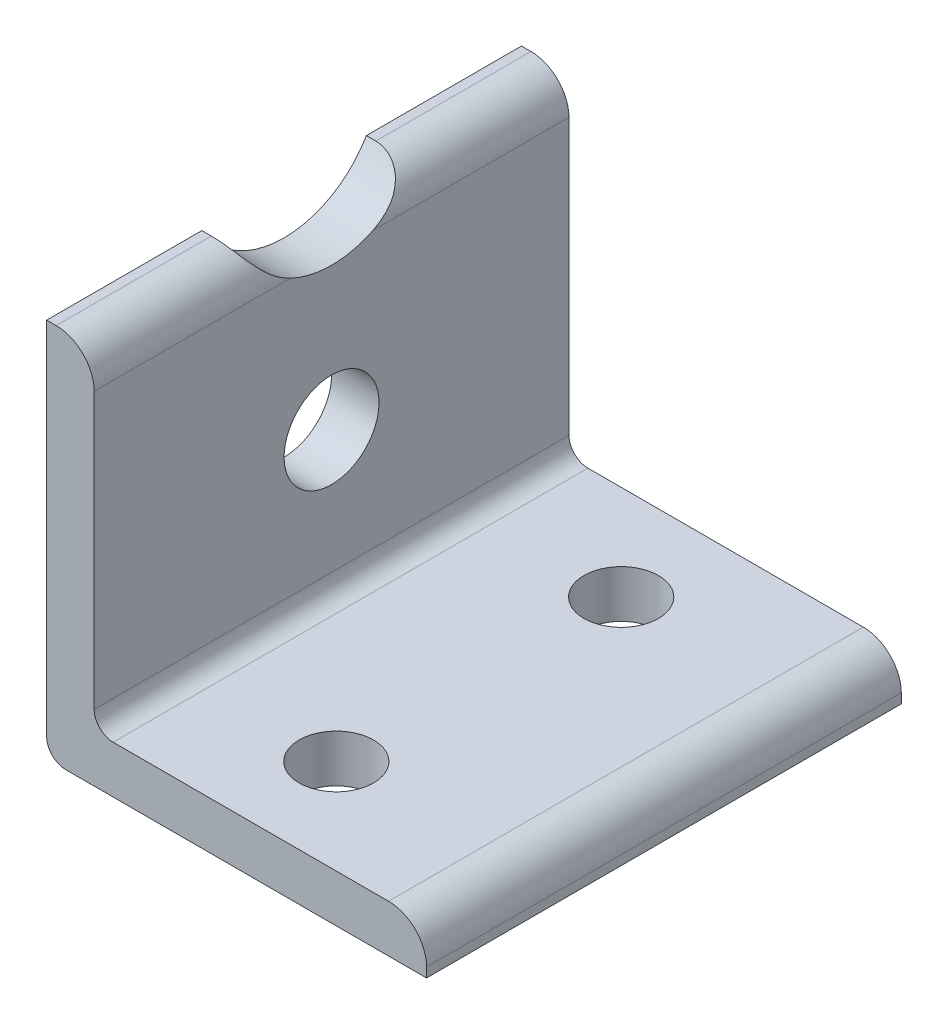
ISO-10303-21;
HEADER;
FILE_DESCRIPTION(('STEP AP214'),'2;1');
FILE_NAME('part.step','',(''),(''),'','','');
FILE_SCHEMA(('AUTOMOTIVE_DESIGN { 1 0 10303 214 1 1 1 1 }'));
ENDSEC;
DATA;
#1=APPLICATION_CONTEXT('core data for automotive mechanical design processes');
#2=APPLICATION_PROTOCOL_DEFINITION('international standard','automotive_design',2000,#1);
#3=PRODUCT_CONTEXT('',#1,'mechanical');
#4=PRODUCT('Part','Part','',(#3));
#5=PRODUCT_RELATED_PRODUCT_CATEGORY('part','',(#4));
#6=PRODUCT_DEFINITION_FORMATION('','',#4);
#7=PRODUCT_DEFINITION_CONTEXT('part definition',#1,'design');
#8=PRODUCT_DEFINITION('design','',#6,#7);
#9=PRODUCT_DEFINITION_SHAPE('','',#8);
#10=(LENGTH_UNIT() NAMED_UNIT(*) SI_UNIT(.MILLI.,.METRE.));
#11=(NAMED_UNIT(*) PLANE_ANGLE_UNIT() SI_UNIT($,.RADIAN.));
#12=(NAMED_UNIT(*) SI_UNIT($,.STERADIAN.) SOLID_ANGLE_UNIT());
#13=UNCERTAINTY_MEASURE_WITH_UNIT(LENGTH_MEASURE(1.E-05),#10,'distance_accuracy_value','');
#14=(GEOMETRIC_REPRESENTATION_CONTEXT(3) GLOBAL_UNCERTAINTY_ASSIGNED_CONTEXT((#13)) GLOBAL_UNIT_ASSIGNED_CONTEXT((#10,
#11,#12)) REPRESENTATION_CONTEXT('',''));
#15=CARTESIAN_POINT('',(0.,0.,0.));
#16=DIRECTION('',(0.,0.,1.));
#17=DIRECTION('',(1.,0.,0.));
#18=AXIS2_PLACEMENT_3D('',#15,#16,#17);
#19=CARTESIAN_POINT('',(0.,25.4,31.75));
#20=DIRECTION('',(0.,-1.,0.));
#21=DIRECTION('',(0.,0.,-1.));
#22=AXIS2_PLACEMENT_3D('',#19,#20,#21);
#23=PLANE('',#22);
#24=DIRECTION('',(0.,0.,-1.));
#25=VECTOR('',#24,1.);
#26=CARTESIAN_POINT('',(0.635,25.4,31.75));
#27=LINE('',#26,#25);
#28=CARTESIAN_POINT('',(0.635,25.4,31.75));
#29=VERTEX_POINT('',#28);
#30=CARTESIAN_POINT('',(0.635,25.4,21.3742613140312));
#31=VERTEX_POINT('',#30);
#32=EDGE_CURVE('E186',#29,#31,#27,.T.);
#33=ORIENTED_EDGE('',*,*,#32,.T.);
#34=DIRECTION('',(-1.,0.,0.));
#35=VECTOR('',#34,1.);
#36=CARTESIAN_POINT('',(25.4,25.4,21.3742613140312));
#37=LINE('',#36,#35);
#38=CARTESIAN_POINT('',(0.,25.4,21.3742613140312));
#39=VERTEX_POINT('',#38);
#40=EDGE_CURVE('E54',#31,#39,#37,.T.);
#41=ORIENTED_EDGE('',*,*,#40,.T.);
#42=DIRECTION('',(0.,0.,-1.));
#43=VECTOR('',#42,1.);
#44=CARTESIAN_POINT('',(0.,25.4,31.75));
#45=LINE('',#44,#43);
#46=CARTESIAN_POINT('',(0.,25.4,31.75));
#47=VERTEX_POINT('',#46);
#48=EDGE_CURVE('E152',#47,#39,#45,.T.);
#49=ORIENTED_EDGE('',*,*,#48,.F.);
#50=DIRECTION('',(-1.,0.,0.));
#51=VECTOR('',#50,1.);
#52=CARTESIAN_POINT('',(0.,25.4,31.75));
#53=LINE('',#52,#51);
#54=EDGE_CURVE('E163',#29,#47,#53,.T.);
#55=ORIENTED_EDGE('',*,*,#54,.F.);
#56=EDGE_LOOP('',(#33,#41,#49,#55));
#57=FACE_BOUND('',#56,.T.);
#58=ADVANCED_FACE('F34',(#57),#23,.F.);
#59=CARTESIAN_POINT('',(0.635,22.86,31.75));
#60=DIRECTION('',(0.,0.,-1.));
#61=DIRECTION('',(-1.,0.,0.));
#62=AXIS2_PLACEMENT_3D('',#59,#60,#61);
#63=CYLINDRICAL_SURFACE('',#62,2.54);
#64=CARTESIAN_POINT('',(3.175,22.86,13.1070991708517));
#65=CARTESIAN_POINT('',(3.17496173971491,22.920021084207,12.9831142225092));
#66=CARTESIAN_POINT('',(3.17286804583168,22.984157509776,12.8610282622567));
#67=CARTESIAN_POINT('',(3.16256142875716,23.1203222344503,12.6210787940381));
#68=CARTESIAN_POINT('',(3.15432789508455,23.1923764159981,12.503230912549));
#69=CARTESIAN_POINT('',(3.12956382380215,23.3445019331483,12.2716955064519));
#70=CARTESIAN_POINT('',(3.11293823183622,23.4246565071578,12.158072029026));
#71=CARTESIAN_POINT('',(3.06904071754311,23.59105288064,11.9377687189921));
#72=CARTESIAN_POINT('',(3.04178577637762,23.6772847919891,11.831078126187));
#73=CARTESIAN_POINT('',(2.96827269249777,23.8698782284666,11.6077201602652));
#74=CARTESIAN_POINT('',(2.91951623941212,23.9771136182152,11.4925958563929));
#75=CARTESIAN_POINT('',(2.80042575736668,24.1932775804573,11.2765006945532));
#76=CARTESIAN_POINT('',(2.73017976208318,24.3021975547259,11.1754744968682));
#77=CARTESIAN_POINT('',(2.60643773770309,24.4630297304954,11.0356403540583));
#78=CARTESIAN_POINT('',(2.56177983968606,24.5165521364283,10.9907292618055));
#79=CARTESIAN_POINT('',(2.46626964061356,24.6215561287344,10.9053582739681));
#80=CARTESIAN_POINT('',(2.41542068622623,24.6730387979432,10.8648959958256));
#81=CARTESIAN_POINT('',(2.30756543793,24.7729894929098,10.7886283858966));
#82=CARTESIAN_POINT('',(2.25055679936086,24.821456359573,10.7528248389501));
#83=CARTESIAN_POINT('',(2.13072133959674,24.9143061256669,10.6860606685778));
#84=CARTESIAN_POINT('',(2.06789569854024,24.9586898498484,10.6550990662432));
#85=CARTESIAN_POINT('',(1.89027434608639,25.0721258737638,10.577842975824));
#86=CARTESIAN_POINT('',(1.77021946429147,25.1363507889079,10.5362461710036));
#87=CARTESIAN_POINT('',(1.51796574079401,25.2455510201271,10.4674592688334));
#88=CARTESIAN_POINT('',(1.38577667431449,25.2905416687328,10.4402576922461));
#89=CARTESIAN_POINT('',(1.15006226899834,25.349359162907,10.4052140800188));
#90=CARTESIAN_POINT('',(1.04826397179947,25.368291948125,10.3941472662686));
#91=CARTESIAN_POINT('',(0.894079584705759,25.3872840113672,10.3830954020693));
#92=CARTESIAN_POINT('',(0.842430743024553,25.3920468534592,10.3803361753396));
#93=CARTESIAN_POINT('',(0.738859268351693,25.3984066302337,10.3766584073938));
#94=CARTESIAN_POINT('',(0.686936565105891,25.4000027085408,10.3757403640809));
#95=CARTESIAN_POINT('',(0.635,25.4,10.3757386859688));
#96=B_SPLINE_CURVE_WITH_KNOTS('',3,(#64,#65,#66,#67,#68,#69,#70,#71,#72,#73,#74,#75,#76,#77,#78,
#79,#80,#81,#82,#83,#84,#85,#86,#87,#88,#89,#90,#91,#92,#93,#94,#95),.UNSPECIFIED.,.F.,.F.,(4,2,
2,2,2,2,2,2,2,2,2,2,2,2,2,4),(0.,0.413287655423655,0.827968933488958,1.24745626911405,
1.6662761703538,2.15871922817654,2.64917137073469,2.89761922653332,3.14593337148276,
3.39434237148719,3.64270108488065,4.06718862624776,4.49133715499615,4.80267822629901,
4.95838575166781,5.1141353786692),.UNSPECIFIED.);
#97=CARTESIAN_POINT('',(3.175,22.86,13.1070991708517));
#98=VERTEX_POINT('',#97);
#99=CARTESIAN_POINT('',(0.635,25.4,10.3757386859688));
#100=VERTEX_POINT('',#99);
#101=EDGE_CURVE('E11',#98,#100,#96,.T.);
#102=ORIENTED_EDGE('',*,*,#101,.F.);
#103=DIRECTION('',(0.,0.,-1.));
#104=VECTOR('',#103,1.);
#105=CARTESIAN_POINT('',(3.175,22.86,31.75));
#106=LINE('',#105,#104);
#107=CARTESIAN_POINT('',(3.175,22.86,0.));
#108=VERTEX_POINT('',#107);
#109=EDGE_CURVE('E190',#108,#98,#106,.F.);
#110=ORIENTED_EDGE('',*,*,#109,.F.);
#111=CARTESIAN_POINT('',(0.635,22.86,0.));
#112=DIRECTION('',(0.,0.,-1.));
#113=DIRECTION('',(-1.,0.,0.));
#114=AXIS2_PLACEMENT_3D('',#111,#112,#113);
#115=CIRCLE('',#114,2.54);
#116=CARTESIAN_POINT('',(0.635,25.4,0.));
#117=VERTEX_POINT('',#116);
#118=EDGE_CURVE('E174',#117,#108,#115,.T.);
#119=ORIENTED_EDGE('',*,*,#118,.F.);
#120=EDGE_CURVE('E185',#100,#117,#27,.T.);
#121=ORIENTED_EDGE('',*,*,#120,.F.);
#122=EDGE_LOOP('',(#102,#110,#119,#121));
#123=FACE_BOUND('',#122,.T.);
#124=ADVANCED_FACE('F249',(#123),#63,.T.);
#125=CARTESIAN_POINT('',(25.4,0.,31.75));
#126=DIRECTION('',(0.,1.,0.));
#127=DIRECTION('',(-1.,0.,0.));
#128=AXIS2_PLACEMENT_3D('',#125,#126,#127);
#129=PLANE('',#128);
#130=CARTESIAN_POINT('',(13.0175,0.,25.4));
#131=DIRECTION('',(0.,1.,0.));
#132=DIRECTION('',(0.,0.,1.));
#133=AXIS2_PLACEMENT_3D('',#130,#131,#132);
#134=CIRCLE('',#133,2.4892);
#135=CARTESIAN_POINT('',(13.0175,0.,27.8892));
#136=VERTEX_POINT('',#135);
#137=EDGE_CURVE('E404',#136,#136,#134,.T.);
#138=ORIENTED_EDGE('',*,*,#137,.T.);
#139=EDGE_LOOP('',(#138));
#140=FACE_BOUND('',#139,.T.);
#141=CARTESIAN_POINT('',(13.0175,0.,6.35));
#142=DIRECTION('',(0.,1.,0.));
#143=DIRECTION('',(0.,0.,1.));
#144=AXIS2_PLACEMENT_3D('',#141,#142,#143);
#145=CIRCLE('',#144,2.4892);
#146=CARTESIAN_POINT('',(13.0175,0.,8.8392));
#147=VERTEX_POINT('',#146);
#148=EDGE_CURVE('E153',#147,#147,#145,.T.);
#149=ORIENTED_EDGE('',*,*,#148,.T.);
#150=EDGE_LOOP('',(#149));
#151=FACE_BOUND('',#150,.T.);
#152=DIRECTION('',(1.,0.,0.));
#153=VECTOR('',#152,1.);
#154=CARTESIAN_POINT('',(25.4,0.,31.75));
#155=LINE('',#154,#153);
#156=CARTESIAN_POINT('',(1.27,0.,31.75));
#157=VERTEX_POINT('',#156);
#158=CARTESIAN_POINT('',(25.4,0.,31.75));
#159=VERTEX_POINT('',#158);
#160=EDGE_CURVE('E275',#157,#159,#155,.T.);
#161=ORIENTED_EDGE('',*,*,#160,.F.);
#162=DIRECTION('',(0.,0.,-1.));
#163=VECTOR('',#162,1.);
#164=CARTESIAN_POINT('',(1.27,0.,31.75));
#165=LINE('',#164,#163);
#166=CARTESIAN_POINT('',(1.27,0.,0.));
#167=VERTEX_POINT('',#166);
#168=EDGE_CURVE('E193',#157,#167,#165,.T.);
#169=ORIENTED_EDGE('',*,*,#168,.T.);
#170=DIRECTION('',(1.,0.,0.));
#171=VECTOR('',#170,1.);
#172=CARTESIAN_POINT('',(25.4,0.,0.));
#173=LINE('',#172,#171);
#174=CARTESIAN_POINT('',(25.4,0.,0.));
#175=VERTEX_POINT('',#174);
#176=EDGE_CURVE('E141',#167,#175,#173,.T.);
#177=ORIENTED_EDGE('',*,*,#176,.T.);
#178=DIRECTION('',(0.,0.,-1.));
#179=VECTOR('',#178,1.);
#180=CARTESIAN_POINT('',(25.4,0.,31.75));
#181=LINE('',#180,#179);
#182=EDGE_CURVE('E161',#159,#175,#181,.T.);
#183=ORIENTED_EDGE('',*,*,#182,.F.);
#184=EDGE_LOOP('',(#161,#169,#177,#183));
#185=FACE_BOUND('',#184,.T.);
#186=ADVANCED_FACE('F246',(#140,#151,#185),#129,.F.);
#187=CARTESIAN_POINT('',(25.4,3.175,31.75));
#188=DIRECTION('',(-1.,0.,0.));
#189=DIRECTION('',(0.,0.,1.));
#190=AXIS2_PLACEMENT_3D('',#187,#188,#189);
#191=PLANE('',#190);
#192=DIRECTION('',(0.,1.,0.));
#193=VECTOR('',#192,1.);
#194=CARTESIAN_POINT('',(25.4,3.175,0.));
#195=LINE('',#194,#193);
#196=CARTESIAN_POINT('',(25.4,0.635,0.));
#197=VERTEX_POINT('',#196);
#198=EDGE_CURVE('E286',#175,#197,#195,.T.);
#199=ORIENTED_EDGE('',*,*,#198,.T.);
#200=DIRECTION('',(0.,0.,-1.));
#201=VECTOR('',#200,1.);
#202=CARTESIAN_POINT('',(25.4,0.635,31.75));
#203=LINE('',#202,#201);
#204=CARTESIAN_POINT('',(25.4,0.635,31.75));
#205=VERTEX_POINT('',#204);
#206=EDGE_CURVE('E179',#197,#205,#203,.F.);
#207=ORIENTED_EDGE('',*,*,#206,.T.);
#208=DIRECTION('',(0.,1.,0.));
#209=VECTOR('',#208,1.);
#210=CARTESIAN_POINT('',(25.4,3.175,31.75));
#211=LINE('',#210,#209);
#212=EDGE_CURVE('E277',#159,#205,#211,.T.);
#213=ORIENTED_EDGE('',*,*,#212,.F.);
#214=ORIENTED_EDGE('',*,*,#182,.T.);
#215=EDGE_LOOP('',(#199,#207,#213,#214));
#216=FACE_BOUND('',#215,.T.);
#217=ADVANCED_FACE('F242',(#216),#191,.F.);
#218=CARTESIAN_POINT('',(3.175,3.175,31.75));
#219=DIRECTION('',(0.,-1.,0.));
#220=DIRECTION('',(0.,0.,-1.));
#221=AXIS2_PLACEMENT_3D('',#218,#219,#220);
#222=PLANE('',#221);
#223=CARTESIAN_POINT('',(13.0175,3.175,25.4));
#224=DIRECTION('',(0.,1.,0.));
#225=DIRECTION('',(0.,0.,1.));
#226=AXIS2_PLACEMENT_3D('',#223,#224,#225);
#227=CIRCLE('',#226,2.4892);
#228=CARTESIAN_POINT('',(13.0175,3.175,27.8892));
#229=VERTEX_POINT('',#228);
#230=EDGE_CURVE('E401',#229,#229,#227,.T.);
#231=ORIENTED_EDGE('',*,*,#230,.F.);
#232=EDGE_LOOP('',(#231));
#233=FACE_BOUND('',#232,.T.);
#234=CARTESIAN_POINT('',(13.0175,3.175,6.35));
#235=DIRECTION('',(0.,1.,0.));
#236=DIRECTION('',(0.,0.,1.));
#237=AXIS2_PLACEMENT_3D('',#234,#235,#236);
#238=CIRCLE('',#237,2.4892);
#239=CARTESIAN_POINT('',(13.0175,3.175,8.8392));
#240=VERTEX_POINT('',#239);
#241=EDGE_CURVE('E407',#240,#240,#238,.T.);
#242=ORIENTED_EDGE('',*,*,#241,.F.);
#243=EDGE_LOOP('',(#242));
#244=FACE_BOUND('',#243,.T.);
#245=DIRECTION('',(-1.,0.,0.));
#246=VECTOR('',#245,1.);
#247=CARTESIAN_POINT('',(3.175,3.175,0.));
#248=LINE('',#247,#246);
#249=CARTESIAN_POINT('',(22.86,3.175,0.));
#250=VERTEX_POINT('',#249);
#251=CARTESIAN_POINT('',(4.445,3.175,0.));
#252=VERTEX_POINT('',#251);
#253=EDGE_CURVE('E289',#250,#252,#248,.T.);
#254=ORIENTED_EDGE('',*,*,#253,.T.);
#255=DIRECTION('',(0.,0.,-1.));
#256=VECTOR('',#255,1.);
#257=CARTESIAN_POINT('',(4.445,3.175,31.75));
#258=LINE('',#257,#256);
#259=CARTESIAN_POINT('',(4.445,3.175,31.75));
#260=VERTEX_POINT('',#259);
#261=EDGE_CURVE('E205',#252,#260,#258,.F.);
#262=ORIENTED_EDGE('',*,*,#261,.T.);
#263=DIRECTION('',(-1.,0.,0.));
#264=VECTOR('',#263,1.);
#265=CARTESIAN_POINT('',(3.175,3.175,31.75));
#266=LINE('',#265,#264);
#267=CARTESIAN_POINT('',(22.86,3.175,31.75));
#268=VERTEX_POINT('',#267);
#269=EDGE_CURVE('E280',#268,#260,#266,.T.);
#270=ORIENTED_EDGE('',*,*,#269,.F.);
#271=DIRECTION('',(0.,0.,-1.));
#272=VECTOR('',#271,1.);
#273=CARTESIAN_POINT('',(22.86,3.175,31.75));
#274=LINE('',#273,#272);
#275=EDGE_CURVE('E171',#268,#250,#274,.T.);
#276=ORIENTED_EDGE('',*,*,#275,.T.);
#277=EDGE_LOOP('',(#254,#262,#270,#276));
#278=FACE_BOUND('',#277,.T.);
#279=ADVANCED_FACE('F238',(#233,#244,#278),#222,.F.);
#280=CARTESIAN_POINT('',(3.175,25.4,31.75));
#281=DIRECTION('',(-1.,0.,0.));
#282=DIRECTION('',(0.,-1.,0.));
#283=AXIS2_PLACEMENT_3D('',#280,#281,#282);
#284=PLANE('',#283);
#285=CARTESIAN_POINT('',(3.175,12.7,15.875));
#286=DIRECTION('',(1.,0.,0.));
#287=DIRECTION('',(0.,1.,0.));
#288=AXIS2_PLACEMENT_3D('',#285,#286,#287);
#289=CIRCLE('',#288,3.175);
#290=CARTESIAN_POINT('',(3.175,15.875,15.875));
#291=VERTEX_POINT('',#290);
#292=EDGE_CURVE('E399',#291,#291,#289,.T.);
#293=ORIENTED_EDGE('',*,*,#292,.F.);
#294=EDGE_LOOP('',(#293));
#295=FACE_BOUND('',#294,.T.);
#296=ORIENTED_EDGE('',*,*,#109,.T.);
#297=CARTESIAN_POINT('',(3.175,28.575,15.875));
#298=DIRECTION('',(-1.,0.,0.));
#299=DIRECTION('',(0.,-1.,0.));
#300=AXIS2_PLACEMENT_3D('',#297,#298,#299);
#301=CIRCLE('',#300,6.35);
#302=CARTESIAN_POINT('',(3.175,22.86,18.6429008291483));
#303=VERTEX_POINT('',#302);
#304=EDGE_CURVE('E142',#98,#303,#301,.T.);
#305=ORIENTED_EDGE('',*,*,#304,.T.);
#306=CARTESIAN_POINT('',(3.175,22.86,31.75));
#307=VERTEX_POINT('',#306);
#308=EDGE_CURVE('E189',#303,#307,#106,.F.);
#309=ORIENTED_EDGE('',*,*,#308,.T.);
#310=DIRECTION('',(0.,1.,0.));
#311=VECTOR('',#310,1.);
#312=CARTESIAN_POINT('',(3.175,25.4,31.75));
#313=LINE('',#312,#311);
#314=CARTESIAN_POINT('',(3.175,4.445,31.75));
#315=VERTEX_POINT('',#314);
#316=EDGE_CURVE('E282',#315,#307,#313,.T.);
#317=ORIENTED_EDGE('',*,*,#316,.F.);
#318=DIRECTION('',(0.,0.,-1.));
#319=VECTOR('',#318,1.);
#320=CARTESIAN_POINT('',(3.175,4.445,0.));
#321=LINE('',#320,#319);
#322=CARTESIAN_POINT('',(3.175,4.445,0.));
#323=VERTEX_POINT('',#322);
#324=EDGE_CURVE('E202',#315,#323,#321,.T.);
#325=ORIENTED_EDGE('',*,*,#324,.T.);
#326=DIRECTION('',(0.,1.,0.));
#327=VECTOR('',#326,1.);
#328=CARTESIAN_POINT('',(3.175,25.4,0.));
#329=LINE('',#328,#327);
#330=EDGE_CURVE('E292',#323,#108,#329,.T.);
#331=ORIENTED_EDGE('',*,*,#330,.T.);
#332=EDGE_LOOP('',(#296,#305,#309,#317,#325,#331));
#333=FACE_BOUND('',#332,.T.);
#334=ADVANCED_FACE('F235',(#295,#333),#284,.F.);
#335=CARTESIAN_POINT('',(0.,25.4,10.3757386859688));
#336=VERTEX_POINT('',#335);
#337=CARTESIAN_POINT('',(0.,25.4,0.));
#338=VERTEX_POINT('',#337);
#339=EDGE_CURVE('E148',#336,#338,#45,.T.);
#340=ORIENTED_EDGE('',*,*,#339,.F.);
#341=DIRECTION('',(-1.,0.,0.));
#342=VECTOR('',#341,1.);
#343=CARTESIAN_POINT('',(25.4,25.4,10.3757386859688));
#344=LINE('',#343,#342);
#345=EDGE_CURVE('E133',#336,#100,#344,.F.);
#346=ORIENTED_EDGE('',*,*,#345,.T.);
#347=ORIENTED_EDGE('',*,*,#120,.T.);
#348=DIRECTION('',(-1.,0.,0.));
#349=VECTOR('',#348,1.);
#350=CARTESIAN_POINT('',(0.,25.4,0.));
#351=LINE('',#350,#349);
#352=EDGE_CURVE('E157',#117,#338,#351,.T.);
#353=ORIENTED_EDGE('',*,*,#352,.T.);
#354=EDGE_LOOP('',(#340,#346,#347,#353));
#355=FACE_BOUND('',#354,.T.);
#356=ADVANCED_FACE('F155',(#355),#23,.F.);
#357=CARTESIAN_POINT('',(0.,0.,31.75));
#358=DIRECTION('',(1.,0.,0.));
#359=DIRECTION('',(0.,0.,-1.));
#360=AXIS2_PLACEMENT_3D('',#357,#358,#359);
#361=PLANE('',#360);
#362=CARTESIAN_POINT('',(0.,12.7,15.875));
#363=DIRECTION('',(1.,0.,0.));
#364=DIRECTION('',(0.,1.,0.));
#365=AXIS2_PLACEMENT_3D('',#362,#363,#364);
#366=CIRCLE('',#365,3.175);
#367=CARTESIAN_POINT('',(0.,15.875,15.875));
#368=VERTEX_POINT('',#367);
#369=EDGE_CURVE('E396',#368,#368,#366,.T.);
#370=ORIENTED_EDGE('',*,*,#369,.T.);
#371=EDGE_LOOP('',(#370));
#372=FACE_BOUND('',#371,.T.);
#373=ORIENTED_EDGE('',*,*,#48,.T.);
#374=CARTESIAN_POINT('',(0.,28.575,15.875));
#375=DIRECTION('',(-1.,0.,0.));
#376=DIRECTION('',(0.,0.,1.));
#377=AXIS2_PLACEMENT_3D('',#374,#375,#376);
#378=CIRCLE('',#377,6.35);
#379=EDGE_CURVE('E136',#336,#39,#378,.T.);
#380=ORIENTED_EDGE('',*,*,#379,.F.);
#381=ORIENTED_EDGE('',*,*,#339,.T.);
#382=DIRECTION('',(0.,-1.,0.));
#383=VECTOR('',#382,1.);
#384=CARTESIAN_POINT('',(0.,0.,0.));
#385=LINE('',#384,#383);
#386=CARTESIAN_POINT('',(0.,1.27,0.));
#387=VERTEX_POINT('',#386);
#388=EDGE_CURVE('E167',#338,#387,#385,.T.);
#389=ORIENTED_EDGE('',*,*,#388,.T.);
#390=DIRECTION('',(0.,0.,-1.));
#391=VECTOR('',#390,1.);
#392=CARTESIAN_POINT('',(0.,1.27,31.75));
#393=LINE('',#392,#391);
#394=CARTESIAN_POINT('',(0.,1.27,31.75));
#395=VERTEX_POINT('',#394);
#396=EDGE_CURVE('E198',#387,#395,#393,.F.);
#397=ORIENTED_EDGE('',*,*,#396,.T.);
#398=DIRECTION('',(0.,-1.,0.));
#399=VECTOR('',#398,1.);
#400=CARTESIAN_POINT('',(0.,0.,31.75));
#401=LINE('',#400,#399);
#402=EDGE_CURVE('E159',#47,#395,#401,.T.);
#403=ORIENTED_EDGE('',*,*,#402,.F.);
#404=EDGE_LOOP('',(#373,#380,#381,#389,#397,#403));
#405=FACE_BOUND('',#404,.T.);
#406=ADVANCED_FACE('F146',(#372,#405),#361,.F.);
#407=CARTESIAN_POINT('',(0.,0.,31.75));
#408=DIRECTION('',(0.,0.,-1.));
#409=DIRECTION('',(-1.,0.,0.));
#410=AXIS2_PLACEMENT_3D('',#407,#408,#409);
#411=PLANE('',#410);
#412=ORIENTED_EDGE('',*,*,#402,.T.);
#413=CARTESIAN_POINT('',(1.27,1.27,31.75));
#414=DIRECTION('',(0.,0.,-1.));
#415=DIRECTION('',(-1.,0.,0.));
#416=AXIS2_PLACEMENT_3D('',#413,#414,#415);
#417=CIRCLE('',#416,1.27);
#418=EDGE_CURVE('E200',#395,#157,#417,.F.);
#419=ORIENTED_EDGE('',*,*,#418,.T.);
#420=ORIENTED_EDGE('',*,*,#160,.T.);
#421=ORIENTED_EDGE('',*,*,#212,.T.);
#422=CARTESIAN_POINT('',(22.86,0.635,31.75));
#423=DIRECTION('',(0.,0.,-1.));
#424=DIRECTION('',(-1.,0.,0.));
#425=AXIS2_PLACEMENT_3D('',#422,#423,#424);
#426=CIRCLE('',#425,2.54);
#427=EDGE_CURVE('E183',#205,#268,#426,.F.);
#428=ORIENTED_EDGE('',*,*,#427,.T.);
#429=ORIENTED_EDGE('',*,*,#269,.T.);
#430=CARTESIAN_POINT('',(4.445,4.445,31.75));
#431=DIRECTION('',(0.,0.,-1.));
#432=DIRECTION('',(-1.,0.,0.));
#433=AXIS2_PLACEMENT_3D('',#430,#431,#432);
#434=CIRCLE('',#433,1.27);
#435=EDGE_CURVE('E62',#260,#315,#434,.T.);
#436=ORIENTED_EDGE('',*,*,#435,.T.);
#437=ORIENTED_EDGE('',*,*,#316,.T.);
#438=CARTESIAN_POINT('',(0.635,22.86,31.75));
#439=DIRECTION('',(0.,0.,-1.));
#440=DIRECTION('',(-1.,0.,0.));
#441=AXIS2_PLACEMENT_3D('',#438,#439,#440);
#442=CIRCLE('',#441,2.54);
#443=EDGE_CURVE('E181',#307,#29,#442,.F.);
#444=ORIENTED_EDGE('',*,*,#443,.T.);
#445=ORIENTED_EDGE('',*,*,#54,.T.);
#446=EDGE_LOOP('',(#412,#419,#420,#421,#428,#429,#436,#437,#444,#445));
#447=FACE_BOUND('',#446,.T.);
#448=ADVANCED_FACE('F221',(#447),#411,.F.);
#449=CARTESIAN_POINT('',(0.,0.,0.));
#450=DIRECTION('',(0.,0.,-1.));
#451=DIRECTION('',(-1.,0.,0.));
#452=AXIS2_PLACEMENT_3D('',#449,#450,#451);
#453=PLANE('',#452);
#454=ORIENTED_EDGE('',*,*,#176,.F.);
#455=CARTESIAN_POINT('',(1.27,1.27,0.));
#456=DIRECTION('',(0.,0.,-1.));
#457=DIRECTION('',(-1.,0.,0.));
#458=AXIS2_PLACEMENT_3D('',#455,#456,#457);
#459=CIRCLE('',#458,1.27);
#460=EDGE_CURVE('E196',#167,#387,#459,.T.);
#461=ORIENTED_EDGE('',*,*,#460,.T.);
#462=ORIENTED_EDGE('',*,*,#388,.F.);
#463=ORIENTED_EDGE('',*,*,#352,.F.);
#464=ORIENTED_EDGE('',*,*,#118,.T.);
#465=ORIENTED_EDGE('',*,*,#330,.F.);
#466=CARTESIAN_POINT('',(4.445,4.445,0.));
#467=DIRECTION('',(0.,0.,-1.));
#468=DIRECTION('',(-1.,0.,0.));
#469=AXIS2_PLACEMENT_3D('',#466,#467,#468);
#470=CIRCLE('',#469,1.27);
#471=EDGE_CURVE('E207',#323,#252,#470,.F.);
#472=ORIENTED_EDGE('',*,*,#471,.T.);
#473=ORIENTED_EDGE('',*,*,#253,.F.);
#474=CARTESIAN_POINT('',(22.86,0.635,0.));
#475=DIRECTION('',(0.,0.,-1.));
#476=DIRECTION('',(-1.,0.,0.));
#477=AXIS2_PLACEMENT_3D('',#474,#475,#476);
#478=CIRCLE('',#477,2.54);
#479=EDGE_CURVE('E177',#250,#197,#478,.T.);
#480=ORIENTED_EDGE('',*,*,#479,.T.);
#481=ORIENTED_EDGE('',*,*,#198,.F.);
#482=EDGE_LOOP('',(#454,#461,#462,#463,#464,#465,#472,#473,#480,#481));
#483=FACE_BOUND('',#482,.T.);
#484=ADVANCED_FACE('F225',(#483),#453,.T.);
#485=CARTESIAN_POINT('',(22.86,0.635,31.75));
#486=DIRECTION('',(0.,0.,-1.));
#487=DIRECTION('',(-1.,0.,0.));
#488=AXIS2_PLACEMENT_3D('',#485,#486,#487);
#489=CYLINDRICAL_SURFACE('',#488,2.54);
#490=ORIENTED_EDGE('',*,*,#427,.F.);
#491=ORIENTED_EDGE('',*,*,#206,.F.);
#492=ORIENTED_EDGE('',*,*,#479,.F.);
#493=ORIENTED_EDGE('',*,*,#275,.F.);
#494=EDGE_LOOP('',(#490,#491,#492,#493));
#495=FACE_BOUND('',#494,.T.);
#496=ADVANCED_FACE('F228',(#495),#489,.T.);
#497=CARTESIAN_POINT('',(0.635,25.4,21.3742613140312));
#498=CARTESIAN_POINT('',(0.697741702580947,25.4000099786299,21.374258862223));
#499=CARTESIAN_POINT('',(0.760479976140457,25.3976754629248,21.3729190274359));
#500=CARTESIAN_POINT('',(0.885491485143133,25.3883925847104,21.3675482107815));
#501=CARTESIAN_POINT('',(0.94776477190849,25.3814447392361,21.3635175304881));
#502=CARTESIAN_POINT('',(1.07127523177428,25.3630292715131,21.3527597241658));
#503=CARTESIAN_POINT('',(1.1325142726347,25.3515709756563,21.346038161669));
#504=CARTESIAN_POINT('',(1.25363034233487,25.3242963751121,21.3298762825449));
#505=CARTESIAN_POINT('',(1.31350737737316,25.3084800902624,21.3204359782932));
#506=CARTESIAN_POINT('',(1.49049095477674,25.2547624265073,21.2879749688975));
#507=CARTESIAN_POINT('',(1.60502882489484,25.2105802078384,21.2608074894936));
#508=CARTESIAN_POINT('',(1.82387606562032,25.1078466611834,21.1952472721871));
#509=CARTESIAN_POINT('',(1.92818612750205,25.0492963052452,21.1568552936223));
#510=CARTESIAN_POINT('',(2.12585119861048,24.9198847014163,21.0681549377391));
#511=CARTESIAN_POINT('',(2.21901153647166,24.8488468438048,21.0176712254162));
#512=CARTESIAN_POINT('',(2.39101134038752,24.6987695438309,20.9055172328811));
#513=CARTESIAN_POINT('',(2.46984574643178,24.6197272895558,20.8438430154229));
#514=CARTESIAN_POINT('',(2.6187796958323,24.4505833719772,20.70455957858));
#515=CARTESIAN_POINT('',(2.68760717702158,24.3601086780498,20.6260515917926));
#516=CARTESIAN_POINT('',(2.8088907514683,24.1782446150945,20.4582690059062));
#517=CARTESIAN_POINT('',(2.86134039175902,24.0868549001427,20.3689901821922));
#518=CARTESIAN_POINT('',(2.94145510519531,23.9267615779582,20.2024231259054));
#519=CARTESIAN_POINT('',(2.97204144451289,23.8575802258286,20.1269567890206));
#520=CARTESIAN_POINT('',(3.02548670627153,23.7216877987474,19.9711621278712));
#521=CARTESIAN_POINT('',(3.04834163667813,23.6549780157466,19.8908313170458));
#522=CARTESIAN_POINT('',(3.08742538458638,23.5247176197012,19.7257455117969));
#523=CARTESIAN_POINT('',(3.10363501833574,23.4611766117154,19.6409784942218));
#524=CARTESIAN_POINT('',(3.1304001148447,23.3380616373843,19.4678074908365));
#525=CARTESIAN_POINT('',(3.14095707660152,23.278486622995,19.3794044759367));
#526=CARTESIAN_POINT('',(3.15875229824908,23.154612993421,19.1851628750132));
#527=CARTESIAN_POINT('',(3.16520077920917,23.0910592669701,19.0787793336662));
#528=CARTESIAN_POINT('',(3.17329666030748,22.970604824851,18.8630545405255));
#529=CARTESIAN_POINT('',(3.17497575879271,22.9136626077964,18.7537377143021));
#530=CARTESIAN_POINT('',(3.175,22.86,18.6429008291483));
#531=B_SPLINE_CURVE_WITH_KNOTS('',3,(#497,#498,#499,#500,#501,#502,#503,#504,#505,#506,#507,
#508,#509,#510,#511,#512,#513,#514,#515,#516,#517,#518,#519,#520,#521,#522,#523,#524,#525,#526,
#527,#528,#529,#530),.UNSPECIFIED.,.F.,.F.,(4,2,2,2,2,2,2,2,2,2,2,2,2,2,2,2,4),(0.,
0.188161376661533,0.376301668855805,0.564054964198082,0.751807404896889,1.12707520777373,
1.50231762964229,1.88337121907232,2.26455913856301,2.67745510552888,3.09051355128499,
3.41063328626905,3.73091806043036,4.05212103540002,4.37323879029574,4.74518382991517,
5.11465099182552),.UNSPECIFIED.);
#532=EDGE_CURVE('E47',#31,#303,#531,.T.);
#533=ORIENTED_EDGE('',*,*,#532,.F.);
#534=ORIENTED_EDGE('',*,*,#32,.F.);
#535=ORIENTED_EDGE('',*,*,#443,.F.);
#536=ORIENTED_EDGE('',*,*,#308,.F.);
#537=EDGE_LOOP('',(#533,#534,#535,#536));
#538=FACE_BOUND('',#537,.T.);
#539=ADVANCED_FACE('F212',(#538),#63,.T.);
#540=CARTESIAN_POINT('',(1.27,1.27,31.75));
#541=DIRECTION('',(0.,0.,-1.));
#542=DIRECTION('',(-1.,0.,0.));
#543=AXIS2_PLACEMENT_3D('',#540,#541,#542);
#544=CYLINDRICAL_SURFACE('',#543,1.27);
#545=ORIENTED_EDGE('',*,*,#418,.F.);
#546=ORIENTED_EDGE('',*,*,#396,.F.);
#547=ORIENTED_EDGE('',*,*,#460,.F.);
#548=ORIENTED_EDGE('',*,*,#168,.F.);
#549=EDGE_LOOP('',(#545,#546,#547,#548));
#550=FACE_BOUND('',#549,.T.);
#551=ADVANCED_FACE('F256',(#550),#544,.T.);
#552=CARTESIAN_POINT('',(4.445,4.445,31.75));
#553=DIRECTION('',(0.,0.,1.));
#554=DIRECTION('',(1.,0.,0.));
#555=AXIS2_PLACEMENT_3D('',#552,#553,#554);
#556=CYLINDRICAL_SURFACE('',#555,1.27);
#557=ORIENTED_EDGE('',*,*,#435,.F.);
#558=ORIENTED_EDGE('',*,*,#261,.F.);
#559=ORIENTED_EDGE('',*,*,#471,.F.);
#560=ORIENTED_EDGE('',*,*,#324,.F.);
#561=EDGE_LOOP('',(#557,#558,#559,#560));
#562=FACE_BOUND('',#561,.T.);
#563=ADVANCED_FACE('F36',(#562),#556,.F.);
#564=CARTESIAN_POINT('',(25.4,28.575,15.875));
#565=DIRECTION('',(-1.,0.,0.));
#566=DIRECTION('',(0.,0.,1.));
#567=AXIS2_PLACEMENT_3D('',#564,#565,#566);
#568=CYLINDRICAL_SURFACE('',#567,6.35);
#569=ORIENTED_EDGE('',*,*,#379,.T.);
#570=ORIENTED_EDGE('',*,*,#40,.F.);
#571=ORIENTED_EDGE('',*,*,#532,.T.);
#572=ORIENTED_EDGE('',*,*,#304,.F.);
#573=ORIENTED_EDGE('',*,*,#101,.T.);
#574=ORIENTED_EDGE('',*,*,#345,.F.);
#575=EDGE_LOOP('',(#569,#570,#571,#572,#573,#574));
#576=FACE_BOUND('',#575,.T.);
#577=ADVANCED_FACE('F135',(#576),#568,.F.);
#578=CARTESIAN_POINT('',(13.0175,0.,6.35));
#579=DIRECTION('',(0.,1.,0.));
#580=DIRECTION('',(0.,0.,1.));
#581=AXIS2_PLACEMENT_3D('',#578,#579,#580);
#582=CYLINDRICAL_SURFACE('',#581,2.4892);
#583=ORIENTED_EDGE('',*,*,#148,.F.);
#584=EDGE_LOOP('',(#583));
#585=FACE_BOUND('',#584,.T.);
#586=ORIENTED_EDGE('',*,*,#241,.T.);
#587=EDGE_LOOP('',(#586));
#588=FACE_BOUND('',#587,.T.);
#589=ADVANCED_FACE('F219',(#585,#588),#582,.F.);
#590=CARTESIAN_POINT('',(13.0175,0.,25.4));
#591=DIRECTION('',(0.,1.,0.));
#592=DIRECTION('',(0.,0.,1.));
#593=AXIS2_PLACEMENT_3D('',#590,#591,#592);
#594=CYLINDRICAL_SURFACE('',#593,2.4892);
#595=ORIENTED_EDGE('',*,*,#137,.F.);
#596=EDGE_LOOP('',(#595));
#597=FACE_BOUND('',#596,.T.);
#598=ORIENTED_EDGE('',*,*,#230,.T.);
#599=EDGE_LOOP('',(#598));
#600=FACE_BOUND('',#599,.T.);
#601=ADVANCED_FACE('F359',(#597,#600),#594,.F.);
#602=CARTESIAN_POINT('',(0.,12.7,15.875));
#603=DIRECTION('',(1.,0.,0.));
#604=DIRECTION('',(0.,1.,0.));
#605=AXIS2_PLACEMENT_3D('',#602,#603,#604);
#606=CYLINDRICAL_SURFACE('',#605,3.175);
#607=ORIENTED_EDGE('',*,*,#369,.F.);
#608=EDGE_LOOP('',(#607));
#609=FACE_BOUND('',#608,.T.);
#610=ORIENTED_EDGE('',*,*,#292,.T.);
#611=EDGE_LOOP('',(#610));
#612=FACE_BOUND('',#611,.T.);
#613=ADVANCED_FACE('F368',(#609,#612),#606,.F.);
#614=CLOSED_SHELL('',(#58,#124,#186,#217,#279,#334,#356,#406,#448,#484,#496,#539,#551,#563,#577,
#589,#601,#613));
#615=MANIFOLD_SOLID_BREP('B2',#614);
#616=ADVANCED_BREP_SHAPE_REPRESENTATION('',(#18,#615),#14);
#617=SHAPE_DEFINITION_REPRESENTATION(#9,#616);
ENDSEC;
END-ISO-10303-21;
